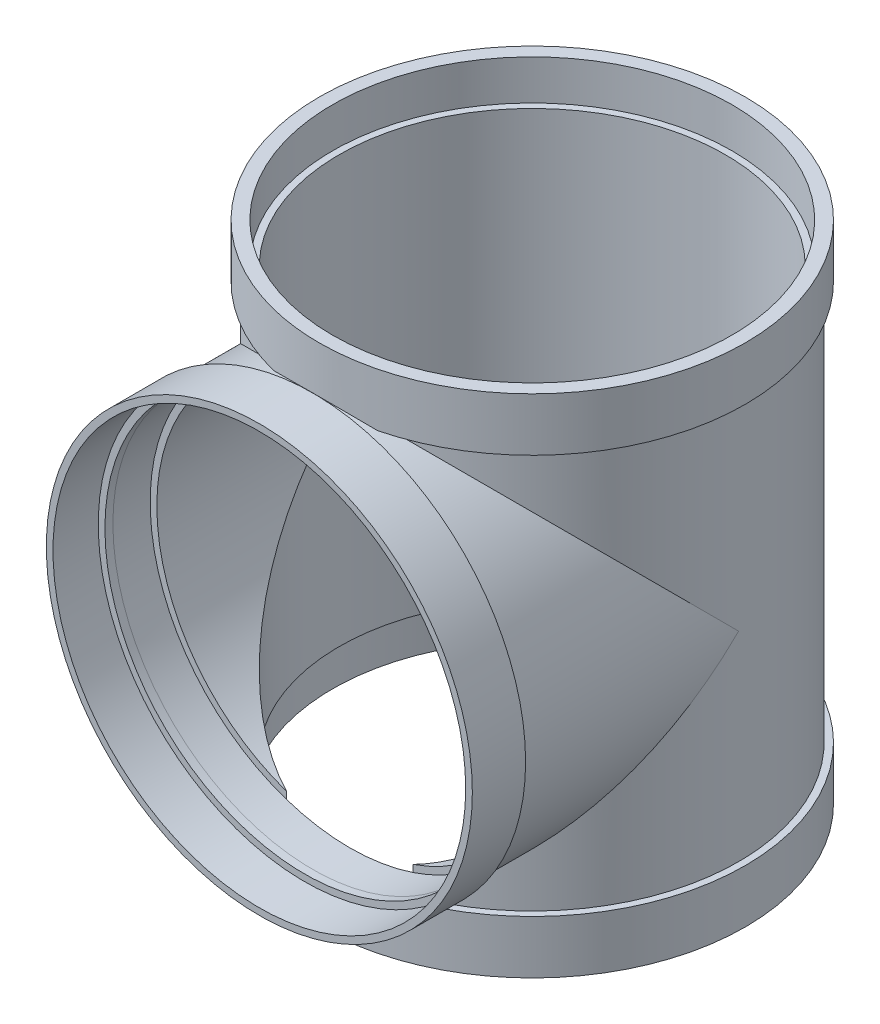
ISO-10303-21;
HEADER;
FILE_DESCRIPTION(('STEP AP214'),'2;1');
FILE_NAME('part.step','',(''),(''),'','','');
FILE_SCHEMA(('AUTOMOTIVE_DESIGN { 1 0 10303 214 1 1 1 1 }'));
ENDSEC;
DATA;
#1=APPLICATION_CONTEXT('core data for automotive mechanical design processes');
#2=APPLICATION_PROTOCOL_DEFINITION('international standard','automotive_design',2000,#1);
#3=PRODUCT_CONTEXT('',#1,'mechanical');
#4=PRODUCT('Part','Part','',(#3));
#5=PRODUCT_RELATED_PRODUCT_CATEGORY('part','',(#4));
#6=PRODUCT_DEFINITION_FORMATION('','',#4);
#7=PRODUCT_DEFINITION_CONTEXT('part definition',#1,'design');
#8=PRODUCT_DEFINITION('design','',#6,#7);
#9=PRODUCT_DEFINITION_SHAPE('','',#8);
#10=(LENGTH_UNIT() NAMED_UNIT(*) SI_UNIT(.MILLI.,.METRE.));
#11=(NAMED_UNIT(*) PLANE_ANGLE_UNIT() SI_UNIT($,.RADIAN.));
#12=(NAMED_UNIT(*) SI_UNIT($,.STERADIAN.) SOLID_ANGLE_UNIT());
#13=UNCERTAINTY_MEASURE_WITH_UNIT(LENGTH_MEASURE(1.E-05),#10,'distance_accuracy_value','');
#14=(GEOMETRIC_REPRESENTATION_CONTEXT(3) GLOBAL_UNCERTAINTY_ASSIGNED_CONTEXT((#13)) GLOBAL_UNIT_ASSIGNED_CONTEXT((#10,
#11,#12)) REPRESENTATION_CONTEXT('',''));
#15=CARTESIAN_POINT('',(0.,0.,0.));
#16=DIRECTION('',(0.,0.,1.));
#17=DIRECTION('',(1.,0.,0.));
#18=AXIS2_PLACEMENT_3D('',#15,#16,#17);
#19=CARTESIAN_POINT('',(0.,75.,102.5));
#20=DIRECTION('',(0.,0.,-1.));
#21=DIRECTION('',(-1.,0.,0.));
#22=AXIS2_PLACEMENT_3D('',#19,#20,#21);
#23=CYLINDRICAL_SURFACE('',#22,80.);
#24=CARTESIAN_POINT('',(0.,75.,102.5));
#25=DIRECTION('',(0.,0.,1.));
#26=DIRECTION('',(1.,0.,0.));
#27=AXIS2_PLACEMENT_3D('',#24,#25,#26);
#28=CIRCLE('',#27,80.);
#29=CARTESIAN_POINT('',(80.,75.,102.5));
#30=VERTEX_POINT('',#29);
#31=EDGE_CURVE('E11',#30,#30,#28,.T.);
#32=ORIENTED_EDGE('',*,*,#31,.F.);
#33=EDGE_LOOP('',(#32));
#34=FACE_BOUND('',#33,.T.);
#35=CARTESIAN_POINT('',(0.,75.,82.5));
#36=DIRECTION('',(0.,0.,1.));
#37=DIRECTION('',(1.,0.,0.));
#38=AXIS2_PLACEMENT_3D('',#35,#36,#37);
#39=CIRCLE('',#38,80.);
#40=CARTESIAN_POINT('',(80.,75.,82.5));
#41=VERTEX_POINT('',#40);
#42=EDGE_CURVE('E44',#41,#41,#39,.T.);
#43=ORIENTED_EDGE('',*,*,#42,.T.);
#44=EDGE_LOOP('',(#43));
#45=FACE_BOUND('',#44,.T.);
#46=ADVANCED_FACE('F41',(#34,#45),#23,.T.);
#47=CARTESIAN_POINT('',(0.,75.,102.5));
#48=DIRECTION('',(0.,0.,1.));
#49=DIRECTION('',(1.,0.,0.));
#50=AXIS2_PLACEMENT_3D('',#47,#48,#49);
#51=PLANE('',#50);
#52=CARTESIAN_POINT('',(0.,75.,102.5));
#53=DIRECTION('',(0.,0.,1.));
#54=DIRECTION('',(1.,0.,0.));
#55=AXIS2_PLACEMENT_3D('',#52,#53,#54);
#56=CIRCLE('',#55,77.5);
#57=CARTESIAN_POINT('',(77.5,75.,102.5));
#58=VERTEX_POINT('',#57);
#59=EDGE_CURVE('E53',#58,#58,#56,.T.);
#60=ORIENTED_EDGE('',*,*,#59,.F.);
#61=EDGE_LOOP('',(#60));
#62=FACE_BOUND('',#61,.T.);
#63=ORIENTED_EDGE('',*,*,#31,.T.);
#64=EDGE_LOOP('',(#63));
#65=FACE_BOUND('',#64,.T.);
#66=ADVANCED_FACE('F81',(#62,#65),#51,.T.);
#67=CARTESIAN_POINT('',(0.,75.,82.5));
#68=DIRECTION('',(0.,0.,1.));
#69=DIRECTION('',(1.,0.,0.));
#70=AXIS2_PLACEMENT_3D('',#67,#68,#69);
#71=PLANE('',#70);
#72=CARTESIAN_POINT('',(0.,75.,82.5));
#73=DIRECTION('',(0.,0.,1.));
#74=DIRECTION('',(1.,0.,0.));
#75=AXIS2_PLACEMENT_3D('',#72,#73,#74);
#76=CIRCLE('',#75,75.);
#77=CARTESIAN_POINT('',(75.,75.,82.5));
#78=VERTEX_POINT('',#77);
#79=EDGE_CURVE('E56',#78,#78,#76,.T.);
#80=ORIENTED_EDGE('',*,*,#79,.T.);
#81=EDGE_LOOP('',(#80));
#82=FACE_BOUND('',#81,.T.);
#83=ORIENTED_EDGE('',*,*,#42,.F.);
#84=EDGE_LOOP('',(#83));
#85=FACE_BOUND('',#84,.T.);
#86=ADVANCED_FACE('F77',(#82,#85),#71,.F.);
#87=CARTESIAN_POINT('',(0.,75.,85.5));
#88=DIRECTION('',(0.,0.,1.));
#89=DIRECTION('',(1.,0.,0.));
#90=AXIS2_PLACEMENT_3D('',#87,#88,#89);
#91=CYLINDRICAL_SURFACE('',#90,77.5);
#92=CARTESIAN_POINT('',(0.,75.,85.5));
#93=DIRECTION('',(0.,0.,1.));
#94=DIRECTION('',(1.,0.,0.));
#95=AXIS2_PLACEMENT_3D('',#92,#93,#94);
#96=CIRCLE('',#95,77.5);
#97=CARTESIAN_POINT('',(77.5,75.,85.5));
#98=VERTEX_POINT('',#97);
#99=EDGE_CURVE('E51',#98,#98,#96,.T.);
#100=ORIENTED_EDGE('',*,*,#99,.F.);
#101=EDGE_LOOP('',(#100));
#102=FACE_BOUND('',#101,.T.);
#103=ORIENTED_EDGE('',*,*,#59,.T.);
#104=EDGE_LOOP('',(#103));
#105=FACE_BOUND('',#104,.T.);
#106=ADVANCED_FACE('F71',(#102,#105),#91,.F.);
#107=CARTESIAN_POINT('',(0.,75.,85.5));
#108=DIRECTION('',(0.,0.,1.));
#109=DIRECTION('',(1.,0.,0.));
#110=AXIS2_PLACEMENT_3D('',#107,#108,#109);
#111=PLANE('',#110);
#112=CARTESIAN_POINT('',(0.,75.,85.5));
#113=DIRECTION('',(0.,0.,1.));
#114=DIRECTION('',(1.,0.,0.));
#115=AXIS2_PLACEMENT_3D('',#112,#113,#114);
#116=CIRCLE('',#115,75.);
#117=CARTESIAN_POINT('',(75.,75.,85.5));
#118=VERTEX_POINT('',#117);
#119=EDGE_CURVE('E61',#118,#118,#116,.T.);
#120=ORIENTED_EDGE('',*,*,#119,.F.);
#121=EDGE_LOOP('',(#120));
#122=FACE_BOUND('',#121,.T.);
#123=ORIENTED_EDGE('',*,*,#99,.T.);
#124=EDGE_LOOP('',(#123));
#125=FACE_BOUND('',#124,.T.);
#126=ADVANCED_FACE('F68',(#122,#125),#111,.T.);
#127=CARTESIAN_POINT('',(0.,75.,68.5));
#128=DIRECTION('',(0.,0.,1.));
#129=DIRECTION('',(1.,0.,0.));
#130=AXIS2_PLACEMENT_3D('',#127,#128,#129);
#131=CYLINDRICAL_SURFACE('',#130,75.);
#132=ORIENTED_EDGE('',*,*,#119,.T.);
#133=EDGE_LOOP('',(#132));
#134=FACE_BOUND('',#133,.T.);
#135=ORIENTED_EDGE('',*,*,#79,.F.);
#136=EDGE_LOOP('',(#135));
#137=FACE_BOUND('',#136,.T.);
#138=ADVANCED_FACE('F65',(#134,#137),#131,.F.);
#139=CLOSED_SHELL('',(#46,#66,#86,#106,#126,#138));
#140=MANIFOLD_SOLID_BREP('B2',#139);
#141=CARTESIAN_POINT('',(0.,75.,68.5));
#142=DIRECTION('',(0.,0.,1.));
#143=DIRECTION('',(1.,0.,0.));
#144=AXIS2_PLACEMENT_3D('',#141,#142,#143);
#145=PLANE('',#144);
#146=CARTESIAN_POINT('',(0.,75.,68.5));
#147=DIRECTION('',(0.,0.,1.));
#148=DIRECTION('',(1.,0.,0.));
#149=AXIS2_PLACEMENT_3D('',#146,#147,#148);
#150=CIRCLE('',#149,72.5);
#151=CARTESIAN_POINT('',(23.7486841740758,143.5,68.5));
#152=VERTEX_POINT('',#151);
#153=CARTESIAN_POINT('',(23.7486841740758,6.49999999999998,68.5));
#154=VERTEX_POINT('',#153);
#155=EDGE_CURVE('E247',#152,#154,#150,.F.);
#156=ORIENTED_EDGE('',*,*,#155,.T.);
#157=DIRECTION('',(0.,-1.,0.));
#158=VECTOR('',#157,1.);
#159=CARTESIAN_POINT('',(23.7486841740758,150.,68.5));
#160=LINE('',#159,#158);
#161=CARTESIAN_POINT('',(23.7486841740758,3.85929435267032,68.5));
#162=VERTEX_POINT('',#161);
#163=EDGE_CURVE('E240',#154,#162,#160,.T.);
#164=ORIENTED_EDGE('',*,*,#163,.T.);
#165=CARTESIAN_POINT('',(0.,75.,68.5));
#166=DIRECTION('',(0.,0.,1.));
#167=DIRECTION('',(1.,0.,0.));
#168=AXIS2_PLACEMENT_3D('',#165,#166,#167);
#169=CIRCLE('',#168,75.);
#170=CARTESIAN_POINT('',(23.7486841740758,146.14070564733,68.5));
#171=VERTEX_POINT('',#170);
#172=EDGE_CURVE('E422',#162,#171,#169,.T.);
#173=ORIENTED_EDGE('',*,*,#172,.T.);
#174=EDGE_CURVE('E39',#171,#152,#160,.T.);
#175=ORIENTED_EDGE('',*,*,#174,.T.);
#176=EDGE_LOOP('',(#156,#164,#173,#175));
#177=FACE_BOUND('',#176,.T.);
#178=ADVANCED_FACE('F133',(#177),#145,.T.);
#179=CARTESIAN_POINT('',(-23.7486841740758,146.14070564733,68.5));
#180=VERTEX_POINT('',#179);
#181=CARTESIAN_POINT('',(-23.7486841740758,3.85929435267032,68.5));
#182=VERTEX_POINT('',#181);
#183=EDGE_CURVE('E421',#180,#182,#169,.T.);
#184=ORIENTED_EDGE('',*,*,#183,.T.);
#185=DIRECTION('',(0.,-1.,0.));
#186=VECTOR('',#185,1.);
#187=CARTESIAN_POINT('',(-23.7486841740758,150.,68.5));
#188=LINE('',#187,#186);
#189=CARTESIAN_POINT('',(-23.7486841740758,6.49999999999998,68.5));
#190=VERTEX_POINT('',#189);
#191=EDGE_CURVE('E142',#182,#190,#188,.F.);
#192=ORIENTED_EDGE('',*,*,#191,.T.);
#193=CARTESIAN_POINT('',(-23.7486841740758,143.5,68.5));
#194=VERTEX_POINT('',#193);
#195=EDGE_CURVE('E427',#190,#194,#150,.F.);
#196=ORIENTED_EDGE('',*,*,#195,.T.);
#197=EDGE_CURVE('E423',#194,#180,#188,.F.);
#198=ORIENTED_EDGE('',*,*,#197,.T.);
#199=EDGE_LOOP('',(#184,#192,#196,#198));
#200=FACE_BOUND('',#199,.T.);
#201=ADVANCED_FACE('F320',(#200),#145,.T.);
#202=CARTESIAN_POINT('',(0.,75.,82.5));
#203=DIRECTION('',(0.,0.,-1.));
#204=DIRECTION('',(-1.,0.,0.));
#205=AXIS2_PLACEMENT_3D('',#202,#203,#204);
#206=CYLINDRICAL_SURFACE('',#205,77.5);
#207=CARTESIAN_POINT('',(0.,75.,82.5));
#208=DIRECTION('',(0.,0.,1.));
#209=DIRECTION('',(1.,0.,0.));
#210=AXIS2_PLACEMENT_3D('',#207,#208,#209);
#211=CIRCLE('',#210,77.5);
#212=CARTESIAN_POINT('',(77.5,75.,82.5));
#213=VERTEX_POINT('',#212);
#214=EDGE_CURVE('E399',#213,#213,#211,.T.);
#215=ORIENTED_EDGE('',*,*,#214,.F.);
#216=EDGE_LOOP('',(#215));
#217=FACE_BOUND('',#216,.T.);
#218=DIRECTION('',(0.,0.,-1.));
#219=VECTOR('',#218,1.);
#220=CARTESIAN_POINT('',(19.5256241897666,150.,82.5));
#221=LINE('',#220,#219);
#222=CARTESIAN_POINT('',(19.5256241897666,150.,77.5806032459145));
#223=VERTEX_POINT('',#222);
#224=CARTESIAN_POINT('',(19.5256241897666,150.,75.));
#225=VERTEX_POINT('',#224);
#226=EDGE_CURVE('E160',#223,#225,#221,.T.);
#227=ORIENTED_EDGE('',*,*,#226,.F.);
#228=CARTESIAN_POINT('',(-19.5256241897667,150.,77.5806032459145));
#229=CARTESIAN_POINT('',(-18.756970866344,150.200128147576,77.7740751408771));
#230=CARTESIAN_POINT('',(-17.9826709839906,150.389077857241,77.9567896930578));
#231=CARTESIAN_POINT('',(-16.4238750798787,150.743941658227,78.3000168398361));
#232=CARTESIAN_POINT('',(-15.6393782585119,150.909853930969,78.4605276816656));
#233=CARTESIAN_POINT('',(-14.061144247831,151.217983638245,78.7586790442131));
#234=CARTESIAN_POINT('',(-13.2674040670669,151.360193160178,78.8963119276264));
#235=CARTESIAN_POINT('',(-11.6722515318613,151.620242120321,79.1480286183453));
#236=CARTESIAN_POINT('',(-10.8708394034273,151.738082274129,79.2621131171414));
#237=CARTESIAN_POINT('',(-9.2852282089967,151.945792938234,79.4632266986632));
#238=CARTESIAN_POINT('',(-8.50121104133031,152.036380543619,79.5509493550262));
#239=CARTESIAN_POINT('',(-6.92855772034051,152.193714560941,79.7033197744439));
#240=CARTESIAN_POINT('',(-6.13992160889559,152.260461188697,79.7679677463813));
#241=CARTESIAN_POINT('',(-4.55952092850014,152.369813755793,79.8738874464499));
#242=CARTESIAN_POINT('',(-3.76775681454095,152.412423084685,79.9151624567971));
#243=CARTESIAN_POINT('',(-2.18250698817611,152.473323066093,79.9741566382667));
#244=CARTESIAN_POINT('',(-1.3890214751067,152.49161639802,79.9918784047523));
#245=CARTESIAN_POINT('',(0.246416892378825,152.50417955496,80.0040489276794));
#246=CARTESIAN_POINT('',(1.08839323743359,152.496926559619,79.9970224371267));
#247=CARTESIAN_POINT('',(2.7710289525544,152.455017153134,79.95642347874));
#248=CARTESIAN_POINT('',(3.61168830468587,152.420360372006,79.9228506524975));
#249=CARTESIAN_POINT('',(5.2902291226244,152.323802251956,79.8293194929873));
#250=CARTESIAN_POINT('',(6.12810964914213,152.261892492364,79.7693530045629));
#251=CARTESIAN_POINT('',(7.79916027068703,152.111133495276,79.6233417859468));
#252=CARTESIAN_POINT('',(8.63233033458766,152.022284079977,79.5372968836346));
#253=CARTESIAN_POINT('',(10.3188668922983,151.814814292013,79.3364040072804));
#254=CARTESIAN_POINT('',(11.1720284611282,151.695333654622,79.2207238224135));
#255=CARTESIAN_POINT('',(12.8699774709385,151.428740059375,78.9626569442447));
#256=CARTESIAN_POINT('',(13.7147645982906,151.281626070718,78.8202692546784));
#257=CARTESIAN_POINT('',(15.3940097648349,150.960546980559,78.5095729729904));
#258=CARTESIAN_POINT('',(16.2284720676609,150.786593391361,78.3412754944173));
#259=CARTESIAN_POINT('',(17.8859567009617,150.41263196925,77.9795668447981));
#260=CARTESIAN_POINT('',(18.7089801101573,150.212626611799,77.7861580598557));
#261=CARTESIAN_POINT('',(19.5256241897666,150.,77.5806032459145));
#262=B_SPLINE_CURVE_WITH_KNOTS('',3,(#228,#229,#230,#231,#232,#233,#234,#235,#236,#237,#238,
#239,#240,#241,#242,#243,#244,#245,#246,#247,#248,#249,#250,#251,#252,#253,#254,#255,#256,#257,
#258,#259,#260,#261),.UNSPECIFIED.,.F.,.F.,(4,2,2,2,2,2,2,2,2,2,2,2,2,2,2,2,4),(0.,
2.45238148032539,4.90495644209419,7.35834850506126,9.81166851471743,12.193251887167,
14.5748136998785,16.9560409918781,19.3370058715365,21.8622405397246,24.3875093023031,
26.9135588748782,29.4396251200224,32.0463761528104,34.6532244440208,37.2589576729179,
39.8644434831769),.UNSPECIFIED.);
#263=CARTESIAN_POINT('',(-19.5256241897667,150.,77.5806032459145));
#264=VERTEX_POINT('',#263);
#265=EDGE_CURVE('E347',#264,#223,#262,.T.);
#266=ORIENTED_EDGE('',*,*,#265,.F.);
#267=DIRECTION('',(0.,0.,-1.));
#268=VECTOR('',#267,1.);
#269=CARTESIAN_POINT('',(-19.5256241897667,150.,82.5));
#270=LINE('',#269,#268);
#271=CARTESIAN_POINT('',(-19.5256241897667,150.,75.));
#272=VERTEX_POINT('',#271);
#273=EDGE_CURVE('E407',#272,#264,#270,.F.);
#274=ORIENTED_EDGE('',*,*,#273,.F.);
#275=CARTESIAN_POINT('',(0.,75.,0.));
#276=DIRECTION('',(0.,-0.707106781186547,0.707106781186547));
#277=DIRECTION('',(0.,-0.707106781186547,-0.707106781186547));
#278=AXIS2_PLACEMENT_3D('',#275,#276,#277);
#279=ELLIPSE('',#278,109.601551083915,77.5);
#280=CARTESIAN_POINT('',(-77.5,75.,0.));
#281=VERTEX_POINT('',#280);
#282=EDGE_CURVE('E394',#272,#281,#279,.T.);
#283=ORIENTED_EDGE('',*,*,#282,.T.);
#284=CARTESIAN_POINT('',(0.,75.,0.));
#285=DIRECTION('',(0.,-0.707106781186547,-0.707106781186547));
#286=DIRECTION('',(0.,-0.707106781186547,0.707106781186547));
#287=AXIS2_PLACEMENT_3D('',#284,#285,#286);
#288=ELLIPSE('',#287,109.601551083915,77.5);
#289=CARTESIAN_POINT('',(-19.5256241897667,0.,75.));
#290=VERTEX_POINT('',#289);
#291=EDGE_CURVE('E397',#281,#290,#288,.F.);
#292=ORIENTED_EDGE('',*,*,#291,.T.);
#293=DIRECTION('',(0.,0.,-1.));
#294=VECTOR('',#293,1.);
#295=CARTESIAN_POINT('',(-19.5256241897667,0.,82.5));
#296=LINE('',#295,#294);
#297=CARTESIAN_POINT('',(-19.5256241897667,0.,77.5806032459145));
#298=VERTEX_POINT('',#297);
#299=EDGE_CURVE('E384',#298,#290,#296,.T.);
#300=ORIENTED_EDGE('',*,*,#299,.F.);
#301=CARTESIAN_POINT('',(19.5256241897666,0.,77.5806032459145));
#302=CARTESIAN_POINT('',(18.7569708663439,-0.200128147576267,77.7740751408771));
#303=CARTESIAN_POINT('',(17.9826709839906,-0.389077857241105,77.9567896930578));
#304=CARTESIAN_POINT('',(16.4238750798787,-0.743941658226923,78.3000168398361));
#305=CARTESIAN_POINT('',(15.6393782585119,-0.909853930969107,78.4605276816656));
#306=CARTESIAN_POINT('',(14.061144247831,-1.21798363824515,78.7586790442131));
#307=CARTESIAN_POINT('',(13.2674040670669,-1.36019316017833,78.8963119276264));
#308=CARTESIAN_POINT('',(11.6722515318613,-1.62024212032065,79.1480286183453));
#309=CARTESIAN_POINT('',(10.8708394034273,-1.73808227412854,79.2621131171414));
#310=CARTESIAN_POINT('',(9.28522820899668,-1.94579293823355,79.4632266986632));
#311=CARTESIAN_POINT('',(8.5012110413303,-2.03638054361921,79.5509493550262));
#312=CARTESIAN_POINT('',(6.92855772034049,-2.19371456094098,79.7033197744439));
#313=CARTESIAN_POINT('',(6.13992160889558,-2.26046118869662,79.7679677463813));
#314=CARTESIAN_POINT('',(4.55952092850012,-2.36981375579349,79.8738874464499));
#315=CARTESIAN_POINT('',(3.76775681454093,-2.4124230846852,79.9151624567971));
#316=CARTESIAN_POINT('',(2.1825069881761,-2.47332306609258,79.9741566382667));
#317=CARTESIAN_POINT('',(1.38902147510669,-2.49161639802009,79.9918784047523));
#318=CARTESIAN_POINT('',(-0.246416892378841,-2.50417955496045,80.0040489276794));
#319=CARTESIAN_POINT('',(-1.0883932374336,-2.49692655961854,79.9970224371267));
#320=CARTESIAN_POINT('',(-2.77102895255442,-2.45501715313414,79.95642347874));
#321=CARTESIAN_POINT('',(-3.61168830468589,-2.42036037200645,79.9228506524975));
#322=CARTESIAN_POINT('',(-5.29022912262441,-2.32380225195642,79.8293194929873));
#323=CARTESIAN_POINT('',(-6.12810964914214,-2.26189249236362,79.7693530045629));
#324=CARTESIAN_POINT('',(-7.79916027068705,-2.11113349527637,79.6233417859468));
#325=CARTESIAN_POINT('',(-8.63233033458768,-2.0222840799772,79.5372968836346));
#326=CARTESIAN_POINT('',(-10.3188668922983,-1.81481429201328,79.3364040072804));
#327=CARTESIAN_POINT('',(-11.1720284611283,-1.69533365462159,79.2207238224135));
#328=CARTESIAN_POINT('',(-12.8699774709385,-1.42874005937456,78.9626569442446));
#329=CARTESIAN_POINT('',(-13.7147645982906,-1.28162607071792,78.8202692546783));
#330=CARTESIAN_POINT('',(-15.3940097648349,-0.960546980558859,78.5095729729904));
#331=CARTESIAN_POINT('',(-16.2284720676609,-0.786593391361043,78.3412754944173));
#332=CARTESIAN_POINT('',(-17.8859567009618,-0.412631969250253,77.9795668447982));
#333=CARTESIAN_POINT('',(-18.7089801101573,-0.21262661179873,77.7861580598557));
#334=CARTESIAN_POINT('',(-19.5256241897667,0.,77.5806032459145));
#335=B_SPLINE_CURVE_WITH_KNOTS('',3,(#301,#302,#303,#304,#305,#306,#307,#308,#309,#310,#311,
#312,#313,#314,#315,#316,#317,#318,#319,#320,#321,#322,#323,#324,#325,#326,#327,#328,#329,#330,
#331,#332,#333,#334),.UNSPECIFIED.,.F.,.F.,(4,2,2,2,2,2,2,2,2,2,2,2,2,2,2,2,4),(0.,
2.45238148032538,4.90495644209419,7.35834850506126,9.81166851471743,12.193251887167,
14.5748136998785,16.9560409918781,19.3370058715365,21.8622405397246,24.3875093023031,
26.9135588748782,29.4396251200224,32.0463761528104,34.6532244440208,37.258957672918,
39.8644434831769),.UNSPECIFIED.);
#336=CARTESIAN_POINT('',(19.5256241897666,0.,77.5806032459145));
#337=VERTEX_POINT('',#336);
#338=EDGE_CURVE('E352',#337,#298,#335,.T.);
#339=ORIENTED_EDGE('',*,*,#338,.F.);
#340=DIRECTION('',(0.,0.,-1.));
#341=VECTOR('',#340,1.);
#342=CARTESIAN_POINT('',(19.5256241897666,0.,82.5));
#343=LINE('',#342,#341);
#344=CARTESIAN_POINT('',(19.5256241897666,0.,75.));
#345=VERTEX_POINT('',#344);
#346=EDGE_CURVE('E382',#345,#337,#343,.F.);
#347=ORIENTED_EDGE('',*,*,#346,.F.);
#348=CARTESIAN_POINT('',(77.5,75.,0.));
#349=VERTEX_POINT('',#348);
#350=EDGE_CURVE('E392',#345,#349,#288,.F.);
#351=ORIENTED_EDGE('',*,*,#350,.T.);
#352=EDGE_CURVE('E389',#349,#225,#279,.T.);
#353=ORIENTED_EDGE('',*,*,#352,.T.);
#354=EDGE_LOOP('',(#227,#266,#274,#283,#292,#300,#339,#347,#351,#353));
#355=FACE_BOUND('',#354,.T.);
#356=ADVANCED_FACE('F325',(#217,#355),#206,.T.);
#357=CARTESIAN_POINT('',(0.,150.,0.));
#358=DIRECTION('',(0.,-1.,0.));
#359=DIRECTION('',(0.,0.,-1.));
#360=AXIS2_PLACEMENT_3D('',#357,#358,#359);
#361=CYLINDRICAL_SURFACE('',#360,77.5);
#362=ORIENTED_EDGE('',*,*,#350,.F.);
#363=CARTESIAN_POINT('',(0.,0.,0.));
#364=DIRECTION('',(0.,1.,0.));
#365=DIRECTION('',(0.,0.,1.));
#366=AXIS2_PLACEMENT_3D('',#363,#364,#365);
#367=CIRCLE('',#366,77.5);
#368=EDGE_CURVE('E380',#345,#290,#367,.T.);
#369=ORIENTED_EDGE('',*,*,#368,.T.);
#370=ORIENTED_EDGE('',*,*,#291,.F.);
#371=ORIENTED_EDGE('',*,*,#282,.F.);
#372=CARTESIAN_POINT('',(0.,150.,0.));
#373=DIRECTION('',(0.,1.,0.));
#374=DIRECTION('',(0.,0.,1.));
#375=AXIS2_PLACEMENT_3D('',#372,#373,#374);
#376=CIRCLE('',#375,77.5);
#377=EDGE_CURVE('E388',#225,#272,#376,.T.);
#378=ORIENTED_EDGE('',*,*,#377,.F.);
#379=ORIENTED_EDGE('',*,*,#352,.F.);
#380=EDGE_LOOP('',(#362,#369,#370,#371,#378,#379));
#381=FACE_BOUND('',#380,.T.);
#382=ADVANCED_FACE('F135',(#381),#361,.T.);
#383=CARTESIAN_POINT('',(0.,75.,82.5));
#384=DIRECTION('',(0.,0.,1.));
#385=DIRECTION('',(1.,0.,0.));
#386=AXIS2_PLACEMENT_3D('',#383,#384,#385);
#387=PLANE('',#386);
#388=CARTESIAN_POINT('',(0.,75.,82.5));
#389=DIRECTION('',(0.,0.,1.));
#390=DIRECTION('',(1.,0.,0.));
#391=AXIS2_PLACEMENT_3D('',#388,#389,#390);
#392=CIRCLE('',#391,75.);
#393=CARTESIAN_POINT('',(75.,75.,82.5));
#394=VERTEX_POINT('',#393);
#395=EDGE_CURVE('E137',#394,#394,#392,.T.);
#396=ORIENTED_EDGE('',*,*,#395,.F.);
#397=EDGE_LOOP('',(#396));
#398=FACE_BOUND('',#397,.T.);
#399=ORIENTED_EDGE('',*,*,#214,.T.);
#400=EDGE_LOOP('',(#399));
#401=FACE_BOUND('',#400,.T.);
#402=ADVANCED_FACE('F362',(#398,#401),#387,.T.);
#403=CARTESIAN_POINT('',(0.,-20.,0.));
#404=DIRECTION('',(0.,1.,0.));
#405=DIRECTION('',(0.,0.,1.));
#406=AXIS2_PLACEMENT_3D('',#403,#404,#405);
#407=CYLINDRICAL_SURFACE('',#406,80.);
#408=CARTESIAN_POINT('',(0.,-20.,0.));
#409=DIRECTION('',(0.,-1.,0.));
#410=DIRECTION('',(0.,0.,-1.));
#411=AXIS2_PLACEMENT_3D('',#408,#409,#410);
#412=CIRCLE('',#411,80.);
#413=CARTESIAN_POINT('',(0.,-20.,-80.));
#414=VERTEX_POINT('',#413);
#415=EDGE_CURVE('E403',#414,#414,#412,.T.);
#416=ORIENTED_EDGE('',*,*,#415,.F.);
#417=EDGE_LOOP('',(#416));
#418=FACE_BOUND('',#417,.T.);
#419=CARTESIAN_POINT('',(0.,0.,0.));
#420=DIRECTION('',(0.,-1.,0.));
#421=DIRECTION('',(0.,0.,-1.));
#422=AXIS2_PLACEMENT_3D('',#419,#420,#421);
#423=CIRCLE('',#422,80.);
#424=EDGE_CURVE('E405',#298,#337,#423,.T.);
#425=ORIENTED_EDGE('',*,*,#424,.T.);
#426=ORIENTED_EDGE('',*,*,#338,.T.);
#427=EDGE_LOOP('',(#425,#426));
#428=FACE_BOUND('',#427,.T.);
#429=ADVANCED_FACE('F365',(#418,#428),#407,.T.);
#430=CARTESIAN_POINT('',(0.,0.,0.));
#431=DIRECTION('',(0.,-1.,0.));
#432=DIRECTION('',(0.,0.,-1.));
#433=AXIS2_PLACEMENT_3D('',#430,#431,#432);
#434=PLANE('',#433);
#435=ORIENTED_EDGE('',*,*,#368,.F.);
#436=ORIENTED_EDGE('',*,*,#346,.T.);
#437=ORIENTED_EDGE('',*,*,#424,.F.);
#438=ORIENTED_EDGE('',*,*,#299,.T.);
#439=EDGE_LOOP('',(#435,#436,#437,#438));
#440=FACE_BOUND('',#439,.T.);
#441=ADVANCED_FACE('F369',(#440),#434,.F.);
#442=CARTESIAN_POINT('',(0.,-20.,0.));
#443=DIRECTION('',(0.,-1.,0.));
#444=DIRECTION('',(0.,0.,-1.));
#445=AXIS2_PLACEMENT_3D('',#442,#443,#444);
#446=PLANE('',#445);
#447=CARTESIAN_POINT('',(0.,-20.,0.));
#448=DIRECTION('',(0.,-1.,0.));
#449=DIRECTION('',(0.,0.,-1.));
#450=AXIS2_PLACEMENT_3D('',#447,#448,#449);
#451=CIRCLE('',#450,75.);
#452=CARTESIAN_POINT('',(0.,-20.,-75.));
#453=VERTEX_POINT('',#452);
#454=EDGE_CURVE('E244',#453,#453,#451,.T.);
#455=ORIENTED_EDGE('',*,*,#454,.F.);
#456=EDGE_LOOP('',(#455));
#457=FACE_BOUND('',#456,.T.);
#458=ORIENTED_EDGE('',*,*,#415,.T.);
#459=EDGE_LOOP('',(#458));
#460=FACE_BOUND('',#459,.T.);
#461=ADVANCED_FACE('F344',(#457,#460),#446,.T.);
#462=CARTESIAN_POINT('',(0.,170.,0.));
#463=DIRECTION('',(0.,-1.,0.));
#464=DIRECTION('',(0.,0.,-1.));
#465=AXIS2_PLACEMENT_3D('',#462,#463,#464);
#466=CYLINDRICAL_SURFACE('',#465,80.);
#467=CARTESIAN_POINT('',(0.,170.,0.));
#468=DIRECTION('',(0.,1.,0.));
#469=DIRECTION('',(0.,0.,1.));
#470=AXIS2_PLACEMENT_3D('',#467,#468,#469);
#471=CIRCLE('',#470,80.);
#472=CARTESIAN_POINT('',(0.,170.,80.));
#473=VERTEX_POINT('',#472);
#474=EDGE_CURVE('E411',#473,#473,#471,.T.);
#475=ORIENTED_EDGE('',*,*,#474,.F.);
#476=EDGE_LOOP('',(#475));
#477=FACE_BOUND('',#476,.T.);
#478=CARTESIAN_POINT('',(0.,150.,0.));
#479=DIRECTION('',(0.,1.,0.));
#480=DIRECTION('',(0.,0.,1.));
#481=AXIS2_PLACEMENT_3D('',#478,#479,#480);
#482=CIRCLE('',#481,80.);
#483=EDGE_CURVE('E414',#223,#264,#482,.T.);
#484=ORIENTED_EDGE('',*,*,#483,.T.);
#485=ORIENTED_EDGE('',*,*,#265,.T.);
#486=EDGE_LOOP('',(#484,#485));
#487=FACE_BOUND('',#486,.T.);
#488=ADVANCED_FACE('F339',(#477,#487),#466,.T.);
#489=CARTESIAN_POINT('',(0.,150.,0.));
#490=DIRECTION('',(0.,1.,0.));
#491=DIRECTION('',(0.,0.,1.));
#492=AXIS2_PLACEMENT_3D('',#489,#490,#491);
#493=PLANE('',#492);
#494=ORIENTED_EDGE('',*,*,#377,.T.);
#495=ORIENTED_EDGE('',*,*,#273,.T.);
#496=ORIENTED_EDGE('',*,*,#483,.F.);
#497=ORIENTED_EDGE('',*,*,#226,.T.);
#498=EDGE_LOOP('',(#494,#495,#496,#497));
#499=FACE_BOUND('',#498,.T.);
#500=ADVANCED_FACE('F335',(#499),#493,.F.);
#501=CARTESIAN_POINT('',(0.,170.,0.));
#502=DIRECTION('',(0.,1.,0.));
#503=DIRECTION('',(0.,0.,1.));
#504=AXIS2_PLACEMENT_3D('',#501,#502,#503);
#505=PLANE('',#504);
#506=CARTESIAN_POINT('',(0.,170.,0.));
#507=DIRECTION('',(0.,1.,0.));
#508=DIRECTION('',(0.,0.,1.));
#509=AXIS2_PLACEMENT_3D('',#506,#507,#508);
#510=CIRCLE('',#509,75.);
#511=CARTESIAN_POINT('',(0.,170.,75.));
#512=VERTEX_POINT('',#511);
#513=EDGE_CURVE('E260',#512,#512,#510,.T.);
#514=ORIENTED_EDGE('',*,*,#513,.F.);
#515=EDGE_LOOP('',(#514));
#516=FACE_BOUND('',#515,.T.);
#517=ORIENTED_EDGE('',*,*,#474,.T.);
#518=EDGE_LOOP('',(#517));
#519=FACE_BOUND('',#518,.T.);
#520=ADVANCED_FACE('F331',(#516,#519),#505,.T.);
#521=CARTESIAN_POINT('',(0.,75.,68.5));
#522=DIRECTION('',(0.,0.,1.));
#523=DIRECTION('',(1.,0.,0.));
#524=AXIS2_PLACEMENT_3D('',#521,#522,#523);
#525=CYLINDRICAL_SURFACE('',#524,75.);
#526=ORIENTED_EDGE('',*,*,#395,.T.);
#527=EDGE_LOOP('',(#526));
#528=FACE_BOUND('',#527,.T.);
#529=EDGE_CURVE('E419',#171,#180,#169,.T.);
#530=ORIENTED_EDGE('',*,*,#529,.F.);
#531=ORIENTED_EDGE('',*,*,#172,.F.);
#532=EDGE_CURVE('E448',#182,#162,#169,.T.);
#533=ORIENTED_EDGE('',*,*,#532,.F.);
#534=ORIENTED_EDGE('',*,*,#183,.F.);
#535=EDGE_LOOP('',(#530,#531,#533,#534));
#536=FACE_BOUND('',#535,.T.);
#537=ADVANCED_FACE('F328',(#528,#536),#525,.F.);
#538=CARTESIAN_POINT('',(0.,75.,68.5));
#539=DIRECTION('',(0.,0.,1.));
#540=DIRECTION('',(1.,0.,0.));
#541=AXIS2_PLACEMENT_3D('',#538,#539,#540);
#542=PLANE('',#541);
#543=ORIENTED_EDGE('',*,*,#529,.T.);
#544=CARTESIAN_POINT('',(-23.7486841740758,151.393717019137,68.5));
#545=VERTEX_POINT('',#544);
#546=EDGE_CURVE('E426',#180,#545,#188,.F.);
#547=ORIENTED_EDGE('',*,*,#546,.T.);
#548=CARTESIAN_POINT('',(0.,75.,68.5));
#549=DIRECTION('',(0.,0.,1.));
#550=DIRECTION('',(1.,0.,0.));
#551=AXIS2_PLACEMENT_3D('',#548,#549,#550);
#552=CIRCLE('',#551,80.);
#553=CARTESIAN_POINT('',(23.7486841740758,151.393717019137,68.5));
#554=VERTEX_POINT('',#553);
#555=EDGE_CURVE('E264',#554,#545,#552,.T.);
#556=ORIENTED_EDGE('',*,*,#555,.F.);
#557=EDGE_CURVE('E144',#554,#171,#160,.T.);
#558=ORIENTED_EDGE('',*,*,#557,.T.);
#559=EDGE_LOOP('',(#543,#547,#556,#558));
#560=FACE_BOUND('',#559,.T.);
#561=ADVANCED_FACE('F294',(#560),#542,.F.);
#562=CARTESIAN_POINT('',(0.,150.,0.));
#563=DIRECTION('',(0.,-1.,0.));
#564=DIRECTION('',(0.,0.,-1.));
#565=AXIS2_PLACEMENT_3D('',#562,#563,#564);
#566=CYLINDRICAL_SURFACE('',#565,72.5);
#567=CARTESIAN_POINT('',(-23.7486841740758,-1.39371701913715,68.5));
#568=CARTESIAN_POINT('',(-23.0387388813933,-1.61443093479418,68.7461461952317));
#569=CARTESIAN_POINT('',(-22.3224607235032,-1.82623750774739,68.9821026509753));
#570=CARTESIAN_POINT('',(-20.8780409183622,-2.23127336990162,69.4329133618473));
#571=CARTESIAN_POINT('',(-20.1498982615192,-2.42450106840376,69.6477658101122));
#572=CARTESIAN_POINT('',(-18.682283612995,-2.791676088299,70.0557117812549));
#573=CARTESIAN_POINT('',(-17.9428058064997,-2.96561310949255,70.2487936807206));
#574=CARTESIAN_POINT('',(-16.4539153305361,-3.29335647313223,70.6123634032084));
#575=CARTESIAN_POINT('',(-15.7045029163457,-3.44716333173953,70.7828518055558));
#576=CARTESIAN_POINT('',(-14.1978208762501,-3.73378663628905,71.1003784680153));
#577=CARTESIAN_POINT('',(-13.4405630537986,-3.86663078532725,71.2474476799525));
#578=CARTESIAN_POINT('',(-11.9183335409714,-4.11098270309654,71.5178364877958));
#579=CARTESIAN_POINT('',(-11.1533612468433,-4.22248878800359,71.6411542094352));
#580=CARTESIAN_POINT('',(-9.61722192924342,-4.42360437095316,71.8634898777726));
#581=CARTESIAN_POINT('',(-8.84605646581158,-4.51321921504244,71.9625137572806));
#582=CARTESIAN_POINT('',(-7.2987001904266,-4.67015564713036,72.1358791293543));
#583=CARTESIAN_POINT('',(-6.52250941365513,-4.73747739102881,72.2102207945273));
#584=CARTESIAN_POINT('',(-4.96350452444422,-4.84971348851313,72.3341374241071));
#585=CARTESIAN_POINT('',(-4.18067641105267,-4.8945403534577,72.3836156890722));
#586=CARTESIAN_POINT('',(-2.61292159311986,-4.96116653923841,72.4571486908617));
#587=CARTESIAN_POINT('',(-1.82799509364316,-4.98296803328553,72.4812058270169));
#588=CARTESIAN_POINT('',(-0.257293808905079,-5.00344254656416,72.5037988121673));
#589=CARTESIAN_POINT('',(0.528481128857117,-5.00211029631008,72.5023288465096));
#590=CARTESIAN_POINT('',(2.09910883896389,-4.97631253304165,72.473861512345));
#591=CARTESIAN_POINT('',(2.88396169572501,-4.95184933511354,72.4468666985205));
#592=CARTESIAN_POINT('',(4.45085800326499,-4.87993855514916,72.3674986807407));
#593=CARTESIAN_POINT('',(5.23290284414479,-4.83250461287527,72.3151405372314));
#594=CARTESIAN_POINT('',(6.79310932655168,-4.71490223309514,72.1852920962859));
#595=CARTESIAN_POINT('',(7.57127132301983,-4.64473591376,72.1078041404097));
#596=CARTESIAN_POINT('',(9.12222171314233,-4.48202893202102,71.9280500427873));
#597=CARTESIAN_POINT('',(9.8950111104185,-4.3894925706214,71.8257886641263));
#598=CARTESIAN_POINT('',(11.4339491388408,-4.18249567030373,71.5969273005375));
#599=CARTESIAN_POINT('',(12.2000982237399,-4.06803664197395,71.4703289925513));
#600=CARTESIAN_POINT('',(13.8905145054736,-3.79047007711955,71.1631464480232));
#601=CARTESIAN_POINT('',(14.8128965144083,-3.62219633120245,70.9768093669174));
#602=CARTESIAN_POINT('',(16.6437042150275,-3.25508778130593,70.5699400500987));
#603=CARTESIAN_POINT('',(17.5521326004277,-3.05625895959234,70.3494145079443));
#604=CARTESIAN_POINT('',(19.3520498915684,-2.62958277652168,69.8756949303235));
#605=CARTESIAN_POINT('',(20.2435610090903,-2.40177700072778,69.6225477043835));
#606=CARTESIAN_POINT('',(22.0094200351488,-1.91829814525277,69.0846460277136));
#607=CARTESIAN_POINT('',(22.8837665290827,-1.662622780015,68.7998889846595));
#608=CARTESIAN_POINT('',(23.7486841740758,-1.39371701913716,68.5));
#609=B_SPLINE_CURVE_WITH_KNOTS('',3,(#567,#568,#569,#570,#571,#572,#573,#574,#575,#576,#577,
#578,#579,#580,#581,#582,#583,#584,#585,#586,#587,#588,#589,#590,#591,#592,#593,#594,#595,#596,
#597,#598,#599,#600,#601,#602,#603,#604,#605,#606,#607,#608),.UNSPECIFIED.,.F.,.F.,(4,2,2,2,2,2,
2,2,2,2,2,2,2,2,2,2,2,2,2,2,4),(0.,2.34935094897253,4.6989028675127,7.04970334305132,
9.40044352947235,11.7480506162834,14.0958428805603,16.4430612174262,18.7902631394089,
21.1465245490502,23.5025635470321,25.8591392188962,28.2154790552651,30.5704214367012,
32.9251444509781,35.27941509105,37.6335235676842,40.5000835566988,43.3660830258308,
46.2280148762195,49.0901816075568),.UNSPECIFIED.);
#610=CARTESIAN_POINT('',(-23.7486841740758,-1.39371701913715,68.5));
#611=VERTEX_POINT('',#610);
#612=CARTESIAN_POINT('',(0.,-5.00000000000003,72.5));
#613=VERTEX_POINT('',#612);
#614=EDGE_CURVE('E428',#611,#613,#609,.T.);
#615=ORIENTED_EDGE('',*,*,#614,.T.);
#616=CARTESIAN_POINT('',(0.,-5.,0.));
#617=DIRECTION('',(0.,-1.,0.));
#618=DIRECTION('',(0.,0.,-1.));
#619=AXIS2_PLACEMENT_3D('',#616,#617,#618);
#620=CIRCLE('',#619,72.5);
#621=EDGE_CURVE('E248',#613,#613,#620,.F.);
#622=ORIENTED_EDGE('',*,*,#621,.F.);
#623=CARTESIAN_POINT('',(23.7486841740758,-1.39371701913715,68.5));
#624=VERTEX_POINT('',#623);
#625=EDGE_CURVE('E280',#613,#624,#609,.T.);
#626=ORIENTED_EDGE('',*,*,#625,.T.);
#627=EDGE_CURVE('E145',#162,#624,#160,.T.);
#628=ORIENTED_EDGE('',*,*,#627,.F.);
#629=ORIENTED_EDGE('',*,*,#163,.F.);
#630=CARTESIAN_POINT('',(0.,75.,0.));
#631=DIRECTION('',(0.,-0.707106781186547,-0.707106781186547));
#632=DIRECTION('',(0.,-0.707106781186547,0.707106781186547));
#633=AXIS2_PLACEMENT_3D('',#630,#631,#632);
#634=ELLIPSE('',#633,102.530483272049,72.5);
#635=CARTESIAN_POINT('',(72.5,75.,0.));
#636=VERTEX_POINT('',#635);
#637=EDGE_CURVE('E233',#154,#636,#634,.F.);
#638=ORIENTED_EDGE('',*,*,#637,.T.);
#639=CARTESIAN_POINT('',(0.,75.,0.));
#640=DIRECTION('',(0.,-0.707106781186547,0.707106781186547));
#641=DIRECTION('',(0.,-0.707106781186547,-0.707106781186547));
#642=AXIS2_PLACEMENT_3D('',#639,#640,#641);
#643=ELLIPSE('',#642,102.530483272049,72.5);
#644=EDGE_CURVE('E237',#636,#152,#643,.T.);
#645=ORIENTED_EDGE('',*,*,#644,.T.);
#646=ORIENTED_EDGE('',*,*,#174,.F.);
#647=ORIENTED_EDGE('',*,*,#557,.F.);
#648=CARTESIAN_POINT('',(23.7486841740758,151.393717019137,68.5));
#649=CARTESIAN_POINT('',(23.0387388813933,151.614430934794,68.7461461952317));
#650=CARTESIAN_POINT('',(22.3224607235032,151.826237507747,68.9821026509753));
#651=CARTESIAN_POINT('',(20.8780409183622,152.231273369902,69.4329133618473));
#652=CARTESIAN_POINT('',(20.1498982615192,152.424501068404,69.6477658101123));
#653=CARTESIAN_POINT('',(18.682283612995,152.791676088299,70.0557117812549));
#654=CARTESIAN_POINT('',(17.9428058064997,152.965613109493,70.2487936807206));
#655=CARTESIAN_POINT('',(16.4539153305361,153.293356473132,70.6123634032084));
#656=CARTESIAN_POINT('',(15.7045029163457,153.44716333174,70.7828518055558));
#657=CARTESIAN_POINT('',(14.1978208762502,153.733786636289,71.1003784680153));
#658=CARTESIAN_POINT('',(13.4405630537986,153.866630785327,71.2474476799525));
#659=CARTESIAN_POINT('',(11.9183335409714,154.110982703097,71.5178364877958));
#660=CARTESIAN_POINT('',(11.1533612468433,154.222488788004,71.6411542094352));
#661=CARTESIAN_POINT('',(9.61722192924343,154.423604370953,71.8634898777726));
#662=CARTESIAN_POINT('',(8.84605646581159,154.513219215042,71.9625137572806));
#663=CARTESIAN_POINT('',(7.29870019042661,154.67015564713,72.1358791293543));
#664=CARTESIAN_POINT('',(6.52250941365514,154.737477391029,72.2102207945273));
#665=CARTESIAN_POINT('',(4.96350452444423,154.849713488513,72.3341374241071));
#666=CARTESIAN_POINT('',(4.18067641105267,154.894540353458,72.3836156890722));
#667=CARTESIAN_POINT('',(2.61292159311986,154.961166539238,72.4571486908617));
#668=CARTESIAN_POINT('',(1.82799509364317,154.982968033286,72.4812058270169));
#669=CARTESIAN_POINT('',(0.257293808905085,155.003442546564,72.5037988121673));
#670=CARTESIAN_POINT('',(-0.528481128857111,155.00211029631,72.5023288465096));
#671=CARTESIAN_POINT('',(-2.09910883896388,154.976312533042,72.473861512345));
#672=CARTESIAN_POINT('',(-2.88396169572501,154.951849335114,72.4468666985205));
#673=CARTESIAN_POINT('',(-4.45085800326498,154.879938555149,72.3674986807407));
#674=CARTESIAN_POINT('',(-5.23290284414478,154.832504612875,72.3151405372314));
#675=CARTESIAN_POINT('',(-6.79310932655167,154.714902233095,72.1852920962859));
#676=CARTESIAN_POINT('',(-7.57127132301982,154.64473591376,72.1078041404097));
#677=CARTESIAN_POINT('',(-9.12222171314232,154.482028932021,71.9280500427873));
#678=CARTESIAN_POINT('',(-9.89501111041849,154.389492570621,71.8257886641263));
#679=CARTESIAN_POINT('',(-11.4339491388408,154.182495670304,71.5969273005375));
#680=CARTESIAN_POINT('',(-12.2000982237399,154.068036641974,71.4703289925513));
#681=CARTESIAN_POINT('',(-13.8905145054736,153.79047007712,71.1631464480232));
#682=CARTESIAN_POINT('',(-14.8128965144083,153.622196331202,70.9768093669174));
#683=CARTESIAN_POINT('',(-16.6437042150275,153.255087781306,70.5699400500987));
#684=CARTESIAN_POINT('',(-17.5521326004277,153.056258959592,70.3494145079443));
#685=CARTESIAN_POINT('',(-19.3520498915684,152.629582776522,69.8756949303235));
#686=CARTESIAN_POINT('',(-20.2435610090903,152.401777000728,69.6225477043835));
#687=CARTESIAN_POINT('',(-22.0094200351488,151.918298145253,69.0846460277136));
#688=CARTESIAN_POINT('',(-22.8837665290827,151.662622780015,68.7998889846595));
#689=CARTESIAN_POINT('',(-23.7486841740758,151.393717019137,68.5));
#690=B_SPLINE_CURVE_WITH_KNOTS('',3,(#648,#649,#650,#651,#652,#653,#654,#655,#656,#657,#658,
#659,#660,#661,#662,#663,#664,#665,#666,#667,#668,#669,#670,#671,#672,#673,#674,#675,#676,#677,
#678,#679,#680,#681,#682,#683,#684,#685,#686,#687,#688,#689),.UNSPECIFIED.,.F.,.F.,(4,2,2,2,2,2,
2,2,2,2,2,2,2,2,2,2,2,2,2,2,4),(0.,2.34935094897253,4.6989028675127,7.04970334305131,
9.40044352947234,11.7480506162834,14.0958428805603,16.4430612174262,18.7902631394089,
21.1465245490502,23.5025635470321,25.8591392188962,28.2154790552651,30.5704214367012,
32.925144450978,35.27941509105,37.6335235676842,40.5000835566988,43.3660830258308,
46.2280148762195,49.0901816075568),.UNSPECIFIED.);
#691=CARTESIAN_POINT('',(0.,155.,72.5));
#692=VERTEX_POINT('',#691);
#693=EDGE_CURVE('E279',#554,#692,#690,.T.);
#694=ORIENTED_EDGE('',*,*,#693,.T.);
#695=CARTESIAN_POINT('',(0.,155.,0.));
#696=DIRECTION('',(0.,1.,0.));
#697=DIRECTION('',(0.,0.,1.));
#698=AXIS2_PLACEMENT_3D('',#695,#696,#697);
#699=CIRCLE('',#698,72.5);
#700=EDGE_CURVE('E251',#692,#692,#699,.T.);
#701=ORIENTED_EDGE('',*,*,#700,.T.);
#702=EDGE_CURVE('E256',#692,#545,#690,.T.);
#703=ORIENTED_EDGE('',*,*,#702,.T.);
#704=ORIENTED_EDGE('',*,*,#546,.F.);
#705=ORIENTED_EDGE('',*,*,#197,.F.);
#706=CARTESIAN_POINT('',(-72.5,75.,0.));
#707=VERTEX_POINT('',#706);
#708=EDGE_CURVE('E152',#194,#707,#643,.T.);
#709=ORIENTED_EDGE('',*,*,#708,.T.);
#710=EDGE_CURVE('E243',#707,#190,#634,.F.);
#711=ORIENTED_EDGE('',*,*,#710,.T.);
#712=ORIENTED_EDGE('',*,*,#191,.F.);
#713=EDGE_CURVE('E425',#611,#182,#188,.F.);
#714=ORIENTED_EDGE('',*,*,#713,.F.);
#715=EDGE_LOOP('',(#615,#622,#626,#628,#629,#638,#645,#646,#647,#694,#701,#703,#704,#705,#709,
#711,#712,#714));
#716=FACE_BOUND('',#715,.T.);
#717=ADVANCED_FACE('F236',(#716),#566,.F.);
#718=CARTESIAN_POINT('',(0.,75.,82.5));
#719=DIRECTION('',(0.,0.,-1.));
#720=DIRECTION('',(-1.,0.,0.));
#721=AXIS2_PLACEMENT_3D('',#718,#719,#720);
#722=CYLINDRICAL_SURFACE('',#721,72.5);
#723=ORIENTED_EDGE('',*,*,#710,.F.);
#724=ORIENTED_EDGE('',*,*,#708,.F.);
#725=ORIENTED_EDGE('',*,*,#195,.F.);
#726=EDGE_LOOP('',(#723,#724,#725));
#727=FACE_BOUND('',#726,.T.);
#728=ADVANCED_FACE('F293',(#727),#722,.F.);
#729=ORIENTED_EDGE('',*,*,#644,.F.);
#730=ORIENTED_EDGE('',*,*,#637,.F.);
#731=ORIENTED_EDGE('',*,*,#155,.F.);
#732=EDGE_LOOP('',(#729,#730,#731));
#733=FACE_BOUND('',#732,.T.);
#734=ADVANCED_FACE('F246',(#733),#722,.F.);
#735=CARTESIAN_POINT('',(0.,75.,68.5));
#736=DIRECTION('',(0.,0.,1.));
#737=DIRECTION('',(1.,0.,0.));
#738=AXIS2_PLACEMENT_3D('',#735,#736,#737);
#739=CYLINDRICAL_SURFACE('',#738,80.);
#740=EDGE_CURVE('E271',#611,#624,#552,.T.);
#741=ORIENTED_EDGE('',*,*,#740,.T.);
#742=ORIENTED_EDGE('',*,*,#625,.F.);
#743=ORIENTED_EDGE('',*,*,#614,.F.);
#744=EDGE_LOOP('',(#741,#742,#743));
#745=FACE_BOUND('',#744,.T.);
#746=ADVANCED_FACE('F285',(#745),#739,.T.);
#747=ORIENTED_EDGE('',*,*,#555,.T.);
#748=ORIENTED_EDGE('',*,*,#702,.F.);
#749=ORIENTED_EDGE('',*,*,#693,.F.);
#750=EDGE_LOOP('',(#747,#748,#749));
#751=FACE_BOUND('',#750,.T.);
#752=ADVANCED_FACE('F301',(#751),#739,.T.);
#753=CARTESIAN_POINT('',(0.,-20.,0.));
#754=DIRECTION('',(0.,1.,0.));
#755=DIRECTION('',(0.,0.,1.));
#756=AXIS2_PLACEMENT_3D('',#753,#754,#755);
#757=CYLINDRICAL_SURFACE('',#756,75.);
#758=CARTESIAN_POINT('',(0.,-5.,0.));
#759=DIRECTION('',(0.,-1.,0.));
#760=DIRECTION('',(0.,0.,-1.));
#761=AXIS2_PLACEMENT_3D('',#758,#759,#760);
#762=CIRCLE('',#761,75.);
#763=CARTESIAN_POINT('',(0.,-5.,-75.));
#764=VERTEX_POINT('',#763);
#765=EDGE_CURVE('E257',#764,#764,#762,.T.);
#766=ORIENTED_EDGE('',*,*,#765,.F.);
#767=EDGE_LOOP('',(#766));
#768=FACE_BOUND('',#767,.T.);
#769=ORIENTED_EDGE('',*,*,#454,.T.);
#770=EDGE_LOOP('',(#769));
#771=FACE_BOUND('',#770,.T.);
#772=ADVANCED_FACE('F296',(#768,#771),#757,.F.);
#773=CARTESIAN_POINT('',(0.,-5.,0.));
#774=DIRECTION('',(0.,-1.,0.));
#775=DIRECTION('',(0.,0.,-1.));
#776=AXIS2_PLACEMENT_3D('',#773,#774,#775);
#777=PLANE('',#776);
#778=ORIENTED_EDGE('',*,*,#621,.T.);
#779=EDGE_LOOP('',(#778));
#780=FACE_BOUND('',#779,.T.);
#781=ORIENTED_EDGE('',*,*,#765,.T.);
#782=EDGE_LOOP('',(#781));
#783=FACE_BOUND('',#782,.T.);
#784=ADVANCED_FACE('F300',(#780,#783),#777,.T.);
#785=CARTESIAN_POINT('',(0.,170.,0.));
#786=DIRECTION('',(0.,-1.,0.));
#787=DIRECTION('',(0.,0.,-1.));
#788=AXIS2_PLACEMENT_3D('',#785,#786,#787);
#789=CYLINDRICAL_SURFACE('',#788,75.);
#790=CARTESIAN_POINT('',(0.,155.,0.));
#791=DIRECTION('',(0.,1.,0.));
#792=DIRECTION('',(0.,0.,1.));
#793=AXIS2_PLACEMENT_3D('',#790,#791,#792);
#794=CIRCLE('',#793,75.);
#795=CARTESIAN_POINT('',(0.,155.,75.));
#796=VERTEX_POINT('',#795);
#797=EDGE_CURVE('E261',#796,#796,#794,.T.);
#798=ORIENTED_EDGE('',*,*,#797,.F.);
#799=EDGE_LOOP('',(#798));
#800=FACE_BOUND('',#799,.T.);
#801=ORIENTED_EDGE('',*,*,#513,.T.);
#802=EDGE_LOOP('',(#801));
#803=FACE_BOUND('',#802,.T.);
#804=ADVANCED_FACE('F305',(#800,#803),#789,.F.);
#805=CARTESIAN_POINT('',(0.,155.,0.));
#806=DIRECTION('',(0.,1.,0.));
#807=DIRECTION('',(0.,0.,1.));
#808=AXIS2_PLACEMENT_3D('',#805,#806,#807);
#809=PLANE('',#808);
#810=ORIENTED_EDGE('',*,*,#700,.F.);
#811=EDGE_LOOP('',(#810));
#812=FACE_BOUND('',#811,.T.);
#813=ORIENTED_EDGE('',*,*,#797,.T.);
#814=EDGE_LOOP('',(#813));
#815=FACE_BOUND('',#814,.T.);
#816=ADVANCED_FACE('F308',(#812,#815),#809,.T.);
#817=ORIENTED_EDGE('',*,*,#532,.T.);
#818=ORIENTED_EDGE('',*,*,#627,.T.);
#819=ORIENTED_EDGE('',*,*,#740,.F.);
#820=ORIENTED_EDGE('',*,*,#713,.T.);
#821=EDGE_LOOP('',(#817,#818,#819,#820));
#822=FACE_BOUND('',#821,.T.);
#823=ADVANCED_FACE('F311',(#822),#542,.F.);
#824=CLOSED_SHELL('',(#178,#201,#356,#382,#402,#429,#441,#461,#488,#500,#520,#537,#561,#717,
#728,#734,#746,#752,#772,#784,#804,#816,#823));
#825=MANIFOLD_SOLID_BREP('B6',#824);
#826=ADVANCED_BREP_SHAPE_REPRESENTATION('',(#18,#140,#825),#14);
#827=SHAPE_DEFINITION_REPRESENTATION(#9,#826);
ENDSEC;
END-ISO-10303-21;
